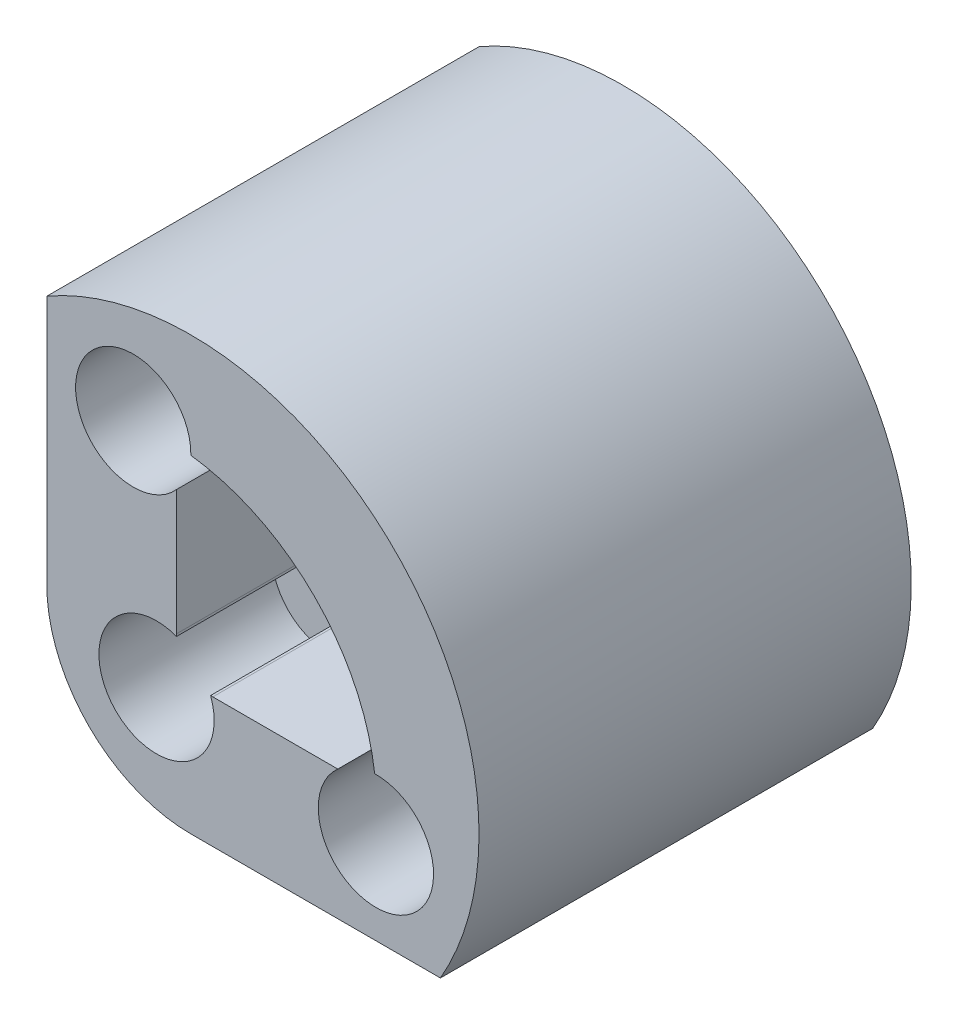
ISO-10303-21;
HEADER;
FILE_DESCRIPTION(('STEP AP214'),'2;1');
FILE_NAME('part.step','',(''),(''),'','','');
FILE_SCHEMA(('AUTOMOTIVE_DESIGN { 1 0 10303 214 1 1 1 1 }'));
ENDSEC;
DATA;
#1=APPLICATION_CONTEXT('core data for automotive mechanical design processes');
#2=APPLICATION_PROTOCOL_DEFINITION('international standard','automotive_design',2000,#1);
#3=PRODUCT_CONTEXT('',#1,'mechanical');
#4=PRODUCT('Part','Part','',(#3));
#5=PRODUCT_RELATED_PRODUCT_CATEGORY('part','',(#4));
#6=PRODUCT_DEFINITION_FORMATION('','',#4);
#7=PRODUCT_DEFINITION_CONTEXT('part definition',#1,'design');
#8=PRODUCT_DEFINITION('design','',#6,#7);
#9=PRODUCT_DEFINITION_SHAPE('','',#8);
#10=(LENGTH_UNIT() NAMED_UNIT(*) SI_UNIT(.MILLI.,.METRE.));
#11=(NAMED_UNIT(*) PLANE_ANGLE_UNIT() SI_UNIT($,.RADIAN.));
#12=(NAMED_UNIT(*) SI_UNIT($,.STERADIAN.) SOLID_ANGLE_UNIT());
#13=UNCERTAINTY_MEASURE_WITH_UNIT(LENGTH_MEASURE(1.E-05),#10,'distance_accuracy_value','');
#14=(GEOMETRIC_REPRESENTATION_CONTEXT(3) GLOBAL_UNCERTAINTY_ASSIGNED_CONTEXT((#13)) GLOBAL_UNIT_ASSIGNED_CONTEXT((#10,
#11,#12)) REPRESENTATION_CONTEXT('',''));
#15=CARTESIAN_POINT('',(0.,0.,0.));
#16=DIRECTION('',(0.,0.,1.));
#17=DIRECTION('',(1.,0.,0.));
#18=AXIS2_PLACEMENT_3D('',#15,#16,#17);
#19=CARTESIAN_POINT('',(-2.49999999999997,-2.5,15.));
#20=DIRECTION('',(0.,0.,-1.));
#21=DIRECTION('',(-1.,0.,0.));
#22=AXIS2_PLACEMENT_3D('',#19,#20,#21);
#23=CYLINDRICAL_SURFACE('',#22,9.99999999999999);
#24=CARTESIAN_POINT('',(-2.49999999999997,-2.5,0.));
#25=DIRECTION('',(0.,0.,1.));
#26=DIRECTION('',(-1.,0.,0.));
#27=AXIS2_PLACEMENT_3D('',#24,#25,#26);
#28=CIRCLE('',#27,9.99999999999999);
#29=CARTESIAN_POINT('',(6.16025403784441,-7.49999999999999,0.));
#30=VERTEX_POINT('',#29);
#31=CARTESIAN_POINT('',(-7.50000000000002,6.16025403784435,0.));
#32=VERTEX_POINT('',#31);
#33=EDGE_CURVE('E251',#30,#32,#28,.T.);
#34=ORIENTED_EDGE('',*,*,#33,.T.);
#35=DIRECTION('',(0.,0.,-1.));
#36=VECTOR('',#35,1.);
#37=CARTESIAN_POINT('',(-7.50000000000002,6.16025403784435,15.));
#38=LINE('',#37,#36);
#39=CARTESIAN_POINT('',(-7.50000000000002,6.16025403784435,15.));
#40=VERTEX_POINT('',#39);
#41=EDGE_CURVE('E291',#40,#32,#38,.T.);
#42=ORIENTED_EDGE('',*,*,#41,.F.);
#43=CARTESIAN_POINT('',(-2.49999999999997,-2.5,15.));
#44=DIRECTION('',(0.,0.,1.));
#45=DIRECTION('',(-1.,0.,0.));
#46=AXIS2_PLACEMENT_3D('',#43,#44,#45);
#47=CIRCLE('',#46,9.99999999999999);
#48=CARTESIAN_POINT('',(6.16025403784441,-7.49999999999999,15.));
#49=VERTEX_POINT('',#48);
#50=EDGE_CURVE('E268',#49,#40,#47,.T.);
#51=ORIENTED_EDGE('',*,*,#50,.F.);
#52=DIRECTION('',(0.,0.,-1.));
#53=VECTOR('',#52,1.);
#54=CARTESIAN_POINT('',(6.16025403784441,-7.49999999999999,15.));
#55=LINE('',#54,#53);
#56=EDGE_CURVE('E277',#49,#30,#55,.T.);
#57=ORIENTED_EDGE('',*,*,#56,.T.);
#58=EDGE_LOOP('',(#34,#42,#51,#57));
#59=FACE_BOUND('',#58,.T.);
#60=ADVANCED_FACE('F39',(#59),#23,.T.);
#61=CARTESIAN_POINT('',(-7.50000000000002,6.16025403784435,15.));
#62=DIRECTION('',(1.,0.,0.));
#63=DIRECTION('',(0.,0.,-1.));
#64=AXIS2_PLACEMENT_3D('',#61,#62,#63);
#65=PLANE('',#64);
#66=DIRECTION('',(0.,-1.,0.));
#67=VECTOR('',#66,1.);
#68=CARTESIAN_POINT('',(-7.50000000000002,6.16025403784435,0.));
#69=LINE('',#68,#67);
#70=CARTESIAN_POINT('',(-7.50000000000002,-2.50000000000003,0.));
#71=VERTEX_POINT('',#70);
#72=EDGE_CURVE('E255',#32,#71,#69,.T.);
#73=ORIENTED_EDGE('',*,*,#72,.T.);
#74=DIRECTION('',(0.,0.,-1.));
#75=VECTOR('',#74,1.);
#76=CARTESIAN_POINT('',(-7.50000000000002,-2.50000000000003,15.));
#77=LINE('',#76,#75);
#78=CARTESIAN_POINT('',(-7.50000000000002,-2.50000000000003,15.));
#79=VERTEX_POINT('',#78);
#80=EDGE_CURVE('E288',#79,#71,#77,.T.);
#81=ORIENTED_EDGE('',*,*,#80,.F.);
#82=DIRECTION('',(0.,-1.,0.));
#83=VECTOR('',#82,1.);
#84=CARTESIAN_POINT('',(-7.50000000000002,6.16025403784435,15.));
#85=LINE('',#84,#83);
#86=EDGE_CURVE('E271',#40,#79,#85,.T.);
#87=ORIENTED_EDGE('',*,*,#86,.F.);
#88=ORIENTED_EDGE('',*,*,#41,.T.);
#89=EDGE_LOOP('',(#73,#81,#87,#88));
#90=FACE_BOUND('',#89,.T.);
#91=ADVANCED_FACE('F370',(#90),#65,.F.);
#92=CARTESIAN_POINT('',(-2.50000000000003,-2.5,15.));
#93=DIRECTION('',(0.,0.,-1.));
#94=DIRECTION('',(-1.,0.,0.));
#95=AXIS2_PLACEMENT_3D('',#92,#93,#94);
#96=CYLINDRICAL_SURFACE('',#95,4.99999999999999);
#97=CARTESIAN_POINT('',(-2.50000000000003,-2.5,0.));
#98=DIRECTION('',(0.,0.,1.));
#99=DIRECTION('',(-1.,0.,0.));
#100=AXIS2_PLACEMENT_3D('',#97,#98,#99);
#101=CIRCLE('',#100,4.99999999999999);
#102=CARTESIAN_POINT('',(-2.50000000000003,-7.49999999999999,0.));
#103=VERTEX_POINT('',#102);
#104=EDGE_CURVE('E280',#71,#103,#101,.T.);
#105=ORIENTED_EDGE('',*,*,#104,.T.);
#106=DIRECTION('',(0.,0.,-1.));
#107=VECTOR('',#106,1.);
#108=CARTESIAN_POINT('',(-2.50000000000003,-7.49999999999999,15.));
#109=LINE('',#108,#107);
#110=CARTESIAN_POINT('',(-2.50000000000003,-7.49999999999999,15.));
#111=VERTEX_POINT('',#110);
#112=EDGE_CURVE('E285',#111,#103,#109,.T.);
#113=ORIENTED_EDGE('',*,*,#112,.F.);
#114=CARTESIAN_POINT('',(-2.50000000000003,-2.5,15.));
#115=DIRECTION('',(0.,0.,1.));
#116=DIRECTION('',(-1.,0.,0.));
#117=AXIS2_PLACEMENT_3D('',#114,#115,#116);
#118=CIRCLE('',#117,4.99999999999999);
#119=EDGE_CURVE('E274',#79,#111,#118,.T.);
#120=ORIENTED_EDGE('',*,*,#119,.F.);
#121=ORIENTED_EDGE('',*,*,#80,.T.);
#122=EDGE_LOOP('',(#105,#113,#120,#121));
#123=FACE_BOUND('',#122,.T.);
#124=ADVANCED_FACE('F375',(#123),#96,.T.);
#125=CARTESIAN_POINT('',(6.16025403784441,-7.49999999999999,15.));
#126=DIRECTION('',(0.,1.,0.));
#127=DIRECTION('',(0.,0.,1.));
#128=AXIS2_PLACEMENT_3D('',#125,#126,#127);
#129=PLANE('',#128);
#130=DIRECTION('',(1.,0.,0.));
#131=VECTOR('',#130,1.);
#132=CARTESIAN_POINT('',(6.16025403784441,-7.49999999999999,0.));
#133=LINE('',#132,#131);
#134=EDGE_CURVE('E272',#103,#30,#133,.T.);
#135=ORIENTED_EDGE('',*,*,#134,.T.);
#136=ORIENTED_EDGE('',*,*,#56,.F.);
#137=DIRECTION('',(1.,0.,0.));
#138=VECTOR('',#137,1.);
#139=CARTESIAN_POINT('',(6.16025403784441,-7.49999999999999,15.));
#140=LINE('',#139,#138);
#141=EDGE_CURVE('E276',#111,#49,#140,.T.);
#142=ORIENTED_EDGE('',*,*,#141,.F.);
#143=ORIENTED_EDGE('',*,*,#112,.T.);
#144=EDGE_LOOP('',(#135,#136,#142,#143));
#145=FACE_BOUND('',#144,.T.);
#146=ADVANCED_FACE('F388',(#145),#129,.F.);
#147=CARTESIAN_POINT('',(-2.49999999999997,-2.5,15.));
#148=DIRECTION('',(0.,0.,-1.));
#149=DIRECTION('',(-1.,0.,0.));
#150=AXIS2_PLACEMENT_3D('',#147,#148,#149);
#151=PLANE('',#150);
#152=CARTESIAN_POINT('',(-3.39843387687094,-3.39843387687098,15.));
#153=DIRECTION('',(0.,0.,1.));
#154=DIRECTION('',(-1.,0.,0.));
#155=AXIS2_PLACEMENT_3D('',#152,#153,#154);
#156=CIRCLE('',#155,7.33188414326815);
#157=CARTESIAN_POINT('',(3.8782566815932,-2.50049200421673,15.));
#158=VERTEX_POINT('',#157);
#159=CARTESIAN_POINT('',(-2.50049200421676,3.87825668159317,15.));
#160=VERTEX_POINT('',#159);
#161=EDGE_CURVE('E316',#158,#160,#156,.T.);
#162=ORIENTED_EDGE('',*,*,#161,.F.);
#163=CARTESIAN_POINT('',(3.92261628933258,-4.49999999999999,15.));
#164=DIRECTION('',(0.,0.,1.));
#165=DIRECTION('',(1.,0.,0.));
#166=AXIS2_PLACEMENT_3D('',#163,#164,#165);
#167=CIRCLE('',#166,2.);
#168=CARTESIAN_POINT('',(2.59974063380028,-2.99999999999999,15.));
#169=VERTEX_POINT('',#168);
#170=EDGE_CURVE('E331',#169,#158,#167,.T.);
#171=ORIENTED_EDGE('',*,*,#170,.F.);
#172=DIRECTION('',(1.,0.,0.));
#173=VECTOR('',#172,1.);
#174=CARTESIAN_POINT('',(-1.73738371066742,-2.99999999999999,15.));
#175=LINE('',#174,#173);
#176=CARTESIAN_POINT('',(-1.73738371066742,-2.99999999999999,15.));
#177=VERTEX_POINT('',#176);
#178=EDGE_CURVE('E261',#177,#169,#175,.T.);
#179=ORIENTED_EDGE('',*,*,#178,.F.);
#180=CARTESIAN_POINT('',(-1.73738371066745,-1.73738371066743,15.));
#181=DIRECTION('',(0.,0.,1.));
#182=DIRECTION('',(1.,0.,0.));
#183=AXIS2_PLACEMENT_3D('',#180,#181,#182);
#184=CIRCLE('',#183,1.26261628933257);
#185=CARTESIAN_POINT('',(-1.81483196734758,-2.99762244266432,15.));
#186=VERTEX_POINT('',#185);
#187=EDGE_CURVE('E315',#186,#177,#184,.T.);
#188=ORIENTED_EDGE('',*,*,#187,.F.);
#189=CARTESIAN_POINT('',(-3.69084842267091,-3.69084842267092,15.));
#190=DIRECTION('',(0.,0.,1.));
#191=DIRECTION('',(1.,0.,0.));
#192=AXIS2_PLACEMENT_3D('',#189,#190,#191);
#193=CIRCLE('',#192,2.);
#194=CARTESIAN_POINT('',(-2.99762244266435,-1.81483196734758,15.));
#195=VERTEX_POINT('',#194);
#196=EDGE_CURVE('E346',#195,#186,#193,.T.);
#197=ORIENTED_EDGE('',*,*,#196,.F.);
#198=CARTESIAN_POINT('',(-3.00000000000002,-1.73738371066746,15.));
#199=VERTEX_POINT('',#198);
#200=EDGE_CURVE('E318',#199,#195,#184,.T.);
#201=ORIENTED_EDGE('',*,*,#200,.F.);
#202=DIRECTION('',(0.,-1.,0.));
#203=VECTOR('',#202,1.);
#204=CARTESIAN_POINT('',(-3.00000000000002,3.92261628933255,15.));
#205=LINE('',#204,#203);
#206=CARTESIAN_POINT('',(-3.00000000000002,2.59974063380025,15.));
#207=VERTEX_POINT('',#206);
#208=EDGE_CURVE('E310',#207,#199,#205,.T.);
#209=ORIENTED_EDGE('',*,*,#208,.F.);
#210=CARTESIAN_POINT('',(-4.50000000000002,3.92261628933255,15.));
#211=DIRECTION('',(0.,0.,1.));
#212=DIRECTION('',(1.,0.,0.));
#213=AXIS2_PLACEMENT_3D('',#210,#211,#212);
#214=CIRCLE('',#213,2.);
#215=EDGE_CURVE('E337',#160,#207,#214,.T.);
#216=ORIENTED_EDGE('',*,*,#215,.F.);
#217=EDGE_LOOP('',(#162,#171,#179,#188,#197,#201,#209,#216));
#218=FACE_BOUND('',#217,.T.);
#219=ORIENTED_EDGE('',*,*,#50,.T.);
#220=ORIENTED_EDGE('',*,*,#86,.T.);
#221=ORIENTED_EDGE('',*,*,#119,.T.);
#222=ORIENTED_EDGE('',*,*,#141,.T.);
#223=EDGE_LOOP('',(#219,#220,#221,#222));
#224=FACE_BOUND('',#223,.T.);
#225=ADVANCED_FACE('F328',(#218,#224),#151,.F.);
#226=CARTESIAN_POINT('',(-2.49999999999997,-2.5,0.));
#227=DIRECTION('',(0.,0.,-1.));
#228=DIRECTION('',(-1.,0.,0.));
#229=AXIS2_PLACEMENT_3D('',#226,#227,#228);
#230=PLANE('',#229);
#231=CARTESIAN_POINT('',(-4.50000000000002,3.92261628933255,0.));
#232=DIRECTION('',(0.,0.,-1.));
#233=DIRECTION('',(-1.,0.,0.));
#234=AXIS2_PLACEMENT_3D('',#231,#232,#233);
#235=CIRCLE('',#234,2.);
#236=CARTESIAN_POINT('',(-3.00000000000002,2.59974063380025,0.));
#237=VERTEX_POINT('',#236);
#238=CARTESIAN_POINT('',(-2.50049200421676,3.87825668159317,0.));
#239=VERTEX_POINT('',#238);
#240=EDGE_CURVE('E174',#237,#239,#235,.T.);
#241=ORIENTED_EDGE('',*,*,#240,.F.);
#242=DIRECTION('',(0.,1.,0.));
#243=VECTOR('',#242,1.);
#244=CARTESIAN_POINT('',(-3.00000000000002,-2.5,0.));
#245=LINE('',#244,#243);
#246=CARTESIAN_POINT('',(-3.00000000000002,-1.73738371066746,0.));
#247=VERTEX_POINT('',#246);
#248=EDGE_CURVE('E294',#247,#237,#245,.T.);
#249=ORIENTED_EDGE('',*,*,#248,.F.);
#250=CARTESIAN_POINT('',(-1.73738371066745,-1.73738371066743,0.));
#251=DIRECTION('',(0.,0.,-1.));
#252=DIRECTION('',(-1.,0.,0.));
#253=AXIS2_PLACEMENT_3D('',#250,#251,#252);
#254=CIRCLE('',#253,1.26261628933257);
#255=CARTESIAN_POINT('',(-2.99762244266435,-1.81483196734758,0.));
#256=VERTEX_POINT('',#255);
#257=EDGE_CURVE('E295',#256,#247,#254,.T.);
#258=ORIENTED_EDGE('',*,*,#257,.F.);
#259=CARTESIAN_POINT('',(-3.69084842267091,-3.69084842267092,0.));
#260=DIRECTION('',(0.,0.,-1.));
#261=DIRECTION('',(-1.,0.,0.));
#262=AXIS2_PLACEMENT_3D('',#259,#260,#261);
#263=CIRCLE('',#262,2.);
#264=CARTESIAN_POINT('',(-1.81483196734758,-2.99762244266432,0.));
#265=VERTEX_POINT('',#264);
#266=EDGE_CURVE('E187',#265,#256,#263,.T.);
#267=ORIENTED_EDGE('',*,*,#266,.F.);
#268=CARTESIAN_POINT('',(-1.73738371066742,-2.99999999999999,0.));
#269=VERTEX_POINT('',#268);
#270=EDGE_CURVE('E210',#269,#265,#254,.T.);
#271=ORIENTED_EDGE('',*,*,#270,.F.);
#272=DIRECTION('',(-1.,0.,0.));
#273=VECTOR('',#272,1.);
#274=CARTESIAN_POINT('',(-2.49999999999997,-2.99999999999999,0.));
#275=LINE('',#274,#273);
#276=CARTESIAN_POINT('',(2.59974063380028,-2.99999999999999,0.));
#277=VERTEX_POINT('',#276);
#278=EDGE_CURVE('E205',#277,#269,#275,.T.);
#279=ORIENTED_EDGE('',*,*,#278,.F.);
#280=CARTESIAN_POINT('',(3.92261628933258,-4.49999999999999,0.));
#281=DIRECTION('',(0.,0.,-1.));
#282=DIRECTION('',(-1.,0.,0.));
#283=AXIS2_PLACEMENT_3D('',#280,#281,#282);
#284=CIRCLE('',#283,2.);
#285=CARTESIAN_POINT('',(3.8782566815932,-2.50049200421673,0.));
#286=VERTEX_POINT('',#285);
#287=EDGE_CURVE('E203',#286,#277,#284,.T.);
#288=ORIENTED_EDGE('',*,*,#287,.F.);
#289=CARTESIAN_POINT('',(-3.39843387687094,-3.39843387687098,0.));
#290=DIRECTION('',(0.,0.,-1.));
#291=DIRECTION('',(-1.,0.,0.));
#292=AXIS2_PLACEMENT_3D('',#289,#290,#291);
#293=CIRCLE('',#292,7.33188414326815);
#294=EDGE_CURVE('E194',#239,#286,#293,.T.);
#295=ORIENTED_EDGE('',*,*,#294,.F.);
#296=EDGE_LOOP('',(#241,#249,#258,#267,#271,#279,#288,#295));
#297=FACE_BOUND('',#296,.T.);
#298=ORIENTED_EDGE('',*,*,#33,.F.);
#299=ORIENTED_EDGE('',*,*,#134,.F.);
#300=ORIENTED_EDGE('',*,*,#104,.F.);
#301=ORIENTED_EDGE('',*,*,#72,.F.);
#302=EDGE_LOOP('',(#298,#299,#300,#301));
#303=FACE_BOUND('',#302,.T.);
#304=ADVANCED_FACE('F200',(#297,#303),#230,.T.);
#305=CARTESIAN_POINT('',(-3.39843387687094,-3.39843387687098,-225.));
#306=DIRECTION('',(0.,0.,1.));
#307=DIRECTION('',(1.,0.,0.));
#308=AXIS2_PLACEMENT_3D('',#305,#306,#307);
#309=CYLINDRICAL_SURFACE('',#308,7.33188414326815);
#310=CARTESIAN_POINT('',(-3.39843387687094,-3.39843387687098,6.00000000000001));
#311=DIRECTION('',(0.,0.,-1.));
#312=DIRECTION('',(-1.,0.,0.));
#313=AXIS2_PLACEMENT_3D('',#310,#311,#312);
#314=CIRCLE('',#313,7.33188414326815);
#315=CARTESIAN_POINT('',(-2.50049200421676,3.87825668159317,6.));
#316=VERTEX_POINT('',#315);
#317=CARTESIAN_POINT('',(-3.00000000000002,3.92261628933255,6.00000000000001));
#318=VERTEX_POINT('',#317);
#319=EDGE_CURVE('E196',#316,#318,#314,.F.);
#320=ORIENTED_EDGE('',*,*,#319,.F.);
#321=DIRECTION('',(0.,0.,-1.));
#322=VECTOR('',#321,1.);
#323=CARTESIAN_POINT('',(-2.50049200421676,3.87825668159317,3.));
#324=LINE('',#323,#322);
#325=EDGE_CURVE('E178',#316,#239,#324,.T.);
#326=ORIENTED_EDGE('',*,*,#325,.T.);
#327=ORIENTED_EDGE('',*,*,#294,.T.);
#328=DIRECTION('',(0.,0.,-1.));
#329=VECTOR('',#328,1.);
#330=CARTESIAN_POINT('',(3.8782566815932,-2.50049200421673,3.));
#331=LINE('',#330,#329);
#332=CARTESIAN_POINT('',(3.8782566815932,-2.50049200421673,6.));
#333=VERTEX_POINT('',#332);
#334=EDGE_CURVE('E247',#286,#333,#331,.F.);
#335=ORIENTED_EDGE('',*,*,#334,.T.);
#336=CARTESIAN_POINT('',(-3.39843387687094,-3.39843387687098,6.00000000000001));
#337=DIRECTION('',(0.,0.,-1.));
#338=DIRECTION('',(-1.,0.,0.));
#339=AXIS2_PLACEMENT_3D('',#336,#337,#338);
#340=CIRCLE('',#339,7.33188414326815);
#341=CARTESIAN_POINT('',(3.92261628933258,-2.99999999999999,6.00000000000001));
#342=VERTEX_POINT('',#341);
#343=EDGE_CURVE('E197',#342,#333,#340,.F.);
#344=ORIENTED_EDGE('',*,*,#343,.F.);
#345=DIRECTION('',(0.,0.,1.));
#346=VECTOR('',#345,1.);
#347=CARTESIAN_POINT('',(3.92261628933258,-2.99999999999999,-225.));
#348=LINE('',#347,#346);
#349=CARTESIAN_POINT('',(3.92261628933258,-2.99999999999999,9.00000000000001));
#350=VERTEX_POINT('',#349);
#351=EDGE_CURVE('E245',#342,#350,#348,.T.);
#352=ORIENTED_EDGE('',*,*,#351,.T.);
#353=CARTESIAN_POINT('',(-3.39843387687094,-3.39843387687098,9.00000000000001));
#354=DIRECTION('',(0.,0.,1.));
#355=DIRECTION('',(1.,0.,0.));
#356=AXIS2_PLACEMENT_3D('',#353,#354,#355);
#357=CIRCLE('',#356,7.33188414326815);
#358=CARTESIAN_POINT('',(3.8782566815932,-2.50049200421673,9.));
#359=VERTEX_POINT('',#358);
#360=EDGE_CURVE('E352',#359,#350,#357,.F.);
#361=ORIENTED_EDGE('',*,*,#360,.F.);
#362=DIRECTION('',(0.,0.,1.));
#363=VECTOR('',#362,1.);
#364=CARTESIAN_POINT('',(3.8782566815932,-2.50049200421673,12.));
#365=LINE('',#364,#363);
#366=EDGE_CURVE('E320',#359,#158,#365,.T.);
#367=ORIENTED_EDGE('',*,*,#366,.T.);
#368=ORIENTED_EDGE('',*,*,#161,.T.);
#369=DIRECTION('',(0.,0.,1.));
#370=VECTOR('',#369,1.);
#371=CARTESIAN_POINT('',(-2.50049200421676,3.87825668159317,12.));
#372=LINE('',#371,#370);
#373=CARTESIAN_POINT('',(-2.50049200421676,3.87825668159317,9.));
#374=VERTEX_POINT('',#373);
#375=EDGE_CURVE('E349',#160,#374,#372,.F.);
#376=ORIENTED_EDGE('',*,*,#375,.T.);
#377=CARTESIAN_POINT('',(-3.39843387687094,-3.39843387687098,9.00000000000001));
#378=DIRECTION('',(0.,0.,1.));
#379=DIRECTION('',(1.,0.,0.));
#380=AXIS2_PLACEMENT_3D('',#377,#378,#379);
#381=CIRCLE('',#380,7.33188414326815);
#382=CARTESIAN_POINT('',(-3.00000000000002,3.92261628933255,9.00000000000001));
#383=VERTEX_POINT('',#382);
#384=EDGE_CURVE('E345',#383,#374,#381,.F.);
#385=ORIENTED_EDGE('',*,*,#384,.F.);
#386=DIRECTION('',(0.,0.,1.));
#387=VECTOR('',#386,1.);
#388=CARTESIAN_POINT('',(-3.00000000000002,3.92261628933255,-225.));
#389=LINE('',#388,#387);
#390=EDGE_CURVE('E266',#318,#383,#389,.T.);
#391=ORIENTED_EDGE('',*,*,#390,.F.);
#392=EDGE_LOOP('',(#320,#326,#327,#335,#344,#352,#361,#367,#368,#376,#385,#391));
#393=FACE_BOUND('',#392,.T.);
#394=ADVANCED_FACE('F192',(#393),#309,.F.);
#395=CARTESIAN_POINT('',(-1.73738371066742,-2.99999999999999,-225.));
#396=DIRECTION('',(0.,-1.,0.));
#397=DIRECTION('',(0.,0.,-1.));
#398=AXIS2_PLACEMENT_3D('',#395,#396,#397);
#399=PLANE('',#398);
#400=DIRECTION('',(1.,0.,0.));
#401=VECTOR('',#400,1.);
#402=CARTESIAN_POINT('',(-1.73738371066742,-2.99999999999999,6.00000000000001));
#403=LINE('',#402,#401);
#404=CARTESIAN_POINT('',(2.59974063380028,-2.99999999999999,6.));
#405=VERTEX_POINT('',#404);
#406=EDGE_CURVE('E46',#405,#342,#403,.T.);
#407=ORIENTED_EDGE('',*,*,#406,.F.);
#408=DIRECTION('',(0.,0.,-1.));
#409=VECTOR('',#408,1.);
#410=CARTESIAN_POINT('',(2.59974063380028,-2.99999999999999,6.));
#411=LINE('',#410,#409);
#412=EDGE_CURVE('E11',#405,#277,#411,.T.);
#413=ORIENTED_EDGE('',*,*,#412,.T.);
#414=ORIENTED_EDGE('',*,*,#278,.T.);
#415=DIRECTION('',(0.,0.,1.));
#416=VECTOR('',#415,1.);
#417=CARTESIAN_POINT('',(-1.73738371066742,-2.99999999999999,-225.));
#418=LINE('',#417,#416);
#419=EDGE_CURVE('E252',#269,#177,#418,.T.);
#420=ORIENTED_EDGE('',*,*,#419,.T.);
#421=ORIENTED_EDGE('',*,*,#178,.T.);
#422=DIRECTION('',(0.,0.,1.));
#423=VECTOR('',#422,1.);
#424=CARTESIAN_POINT('',(2.59974063380028,-2.99999999999999,9.));
#425=LINE('',#424,#423);
#426=CARTESIAN_POINT('',(2.59974063380028,-2.99999999999999,9.));
#427=VERTEX_POINT('',#426);
#428=EDGE_CURVE('E226',#169,#427,#425,.F.);
#429=ORIENTED_EDGE('',*,*,#428,.T.);
#430=DIRECTION('',(-1.,0.,0.));
#431=VECTOR('',#430,1.);
#432=CARTESIAN_POINT('',(-1.73738371066742,-2.99999999999999,9.00000000000001));
#433=LINE('',#432,#431);
#434=EDGE_CURVE('E224',#350,#427,#433,.T.);
#435=ORIENTED_EDGE('',*,*,#434,.F.);
#436=ORIENTED_EDGE('',*,*,#351,.F.);
#437=EDGE_LOOP('',(#407,#413,#414,#420,#421,#429,#435,#436));
#438=FACE_BOUND('',#437,.T.);
#439=ADVANCED_FACE('F250',(#438),#399,.F.);
#440=CARTESIAN_POINT('',(-1.73738371066745,-1.73738371066743,-225.));
#441=DIRECTION('',(0.,0.,1.));
#442=DIRECTION('',(1.,0.,0.));
#443=AXIS2_PLACEMENT_3D('',#440,#441,#442);
#444=CYLINDRICAL_SURFACE('',#443,1.26261628933257);
#445=ORIENTED_EDGE('',*,*,#270,.T.);
#446=DIRECTION('',(0.,0.,-1.));
#447=VECTOR('',#446,1.);
#448=CARTESIAN_POINT('',(-1.81483196734758,-2.99762244266432,3.));
#449=LINE('',#448,#447);
#450=CARTESIAN_POINT('',(-1.81483196734758,-2.99762244266432,6.));
#451=VERTEX_POINT('',#450);
#452=EDGE_CURVE('E237',#265,#451,#449,.F.);
#453=ORIENTED_EDGE('',*,*,#452,.T.);
#454=CARTESIAN_POINT('',(-1.73738371066745,-1.73738371066743,6.00000000000001));
#455=DIRECTION('',(0.,0.,-1.));
#456=DIRECTION('',(-1.,0.,0.));
#457=AXIS2_PLACEMENT_3D('',#454,#455,#456);
#458=CIRCLE('',#457,1.26261628933257);
#459=CARTESIAN_POINT('',(-2.99762244266435,-1.81483196734758,6.));
#460=VERTEX_POINT('',#459);
#461=EDGE_CURVE('E232',#460,#451,#458,.F.);
#462=ORIENTED_EDGE('',*,*,#461,.F.);
#463=DIRECTION('',(0.,0.,-1.));
#464=VECTOR('',#463,1.);
#465=CARTESIAN_POINT('',(-2.99762244266435,-1.81483196734758,3.));
#466=LINE('',#465,#464);
#467=EDGE_CURVE('E234',#460,#256,#466,.T.);
#468=ORIENTED_EDGE('',*,*,#467,.T.);
#469=ORIENTED_EDGE('',*,*,#257,.T.);
#470=DIRECTION('',(0.,0.,1.));
#471=VECTOR('',#470,1.);
#472=CARTESIAN_POINT('',(-3.00000000000002,-1.73738371066746,-225.));
#473=LINE('',#472,#471);
#474=EDGE_CURVE('E258',#247,#199,#473,.T.);
#475=ORIENTED_EDGE('',*,*,#474,.T.);
#476=ORIENTED_EDGE('',*,*,#200,.T.);
#477=DIRECTION('',(0.,0.,1.));
#478=VECTOR('',#477,1.);
#479=CARTESIAN_POINT('',(-2.99762244266435,-1.81483196734758,12.));
#480=LINE('',#479,#478);
#481=CARTESIAN_POINT('',(-2.99762244266435,-1.81483196734758,9.00000000000001));
#482=VERTEX_POINT('',#481);
#483=EDGE_CURVE('E218',#195,#482,#480,.F.);
#484=ORIENTED_EDGE('',*,*,#483,.T.);
#485=CARTESIAN_POINT('',(-1.73738371066745,-1.73738371066743,9.00000000000001));
#486=DIRECTION('',(0.,0.,1.));
#487=DIRECTION('',(1.,0.,0.));
#488=AXIS2_PLACEMENT_3D('',#485,#486,#487);
#489=CIRCLE('',#488,1.26261628933257);
#490=CARTESIAN_POINT('',(-1.81483196734758,-2.99762244266432,9.00000000000001));
#491=VERTEX_POINT('',#490);
#492=EDGE_CURVE('E216',#491,#482,#489,.F.);
#493=ORIENTED_EDGE('',*,*,#492,.F.);
#494=DIRECTION('',(0.,0.,1.));
#495=VECTOR('',#494,1.);
#496=CARTESIAN_POINT('',(-1.81483196734758,-2.99762244266432,12.));
#497=LINE('',#496,#495);
#498=EDGE_CURVE('E221',#491,#186,#497,.T.);
#499=ORIENTED_EDGE('',*,*,#498,.T.);
#500=ORIENTED_EDGE('',*,*,#187,.T.);
#501=ORIENTED_EDGE('',*,*,#419,.F.);
#502=EDGE_LOOP('',(#445,#453,#462,#468,#469,#475,#476,#484,#493,#499,#500,#501));
#503=FACE_BOUND('',#502,.T.);
#504=ADVANCED_FACE('F302',(#503),#444,.F.);
#505=CARTESIAN_POINT('',(-3.00000000000002,3.92261628933255,-225.));
#506=DIRECTION('',(-1.,0.,0.));
#507=DIRECTION('',(0.,-1.,0.));
#508=AXIS2_PLACEMENT_3D('',#505,#506,#507);
#509=PLANE('',#508);
#510=ORIENTED_EDGE('',*,*,#248,.T.);
#511=DIRECTION('',(0.,0.,-1.));
#512=VECTOR('',#511,1.);
#513=CARTESIAN_POINT('',(-3.00000000000002,2.59974063380025,6.));
#514=LINE('',#513,#512);
#515=CARTESIAN_POINT('',(-3.00000000000002,2.59974063380025,6.));
#516=VERTEX_POINT('',#515);
#517=EDGE_CURVE('E181',#237,#516,#514,.F.);
#518=ORIENTED_EDGE('',*,*,#517,.T.);
#519=DIRECTION('',(0.,-1.,0.));
#520=VECTOR('',#519,1.);
#521=CARTESIAN_POINT('',(-3.00000000000002,3.92261628933255,6.00000000000001));
#522=LINE('',#521,#520);
#523=EDGE_CURVE('E229',#318,#516,#522,.T.);
#524=ORIENTED_EDGE('',*,*,#523,.F.);
#525=ORIENTED_EDGE('',*,*,#390,.T.);
#526=DIRECTION('',(0.,1.,0.));
#527=VECTOR('',#526,1.);
#528=CARTESIAN_POINT('',(-3.00000000000002,3.92261628933255,9.00000000000001));
#529=LINE('',#528,#527);
#530=CARTESIAN_POINT('',(-3.00000000000002,2.59974063380025,9.));
#531=VERTEX_POINT('',#530);
#532=EDGE_CURVE('E204',#531,#383,#529,.T.);
#533=ORIENTED_EDGE('',*,*,#532,.F.);
#534=DIRECTION('',(0.,0.,1.));
#535=VECTOR('',#534,1.);
#536=CARTESIAN_POINT('',(-3.00000000000002,2.59974063380025,9.));
#537=LINE('',#536,#535);
#538=EDGE_CURVE('E208',#531,#207,#537,.T.);
#539=ORIENTED_EDGE('',*,*,#538,.T.);
#540=ORIENTED_EDGE('',*,*,#208,.T.);
#541=ORIENTED_EDGE('',*,*,#474,.F.);
#542=EDGE_LOOP('',(#510,#518,#524,#525,#533,#539,#540,#541));
#543=FACE_BOUND('',#542,.T.);
#544=ADVANCED_FACE('F308',(#543),#509,.F.);
#545=CARTESIAN_POINT('',(-4.50000000000002,3.92261628933255,9.));
#546=DIRECTION('',(0.,0.,1.));
#547=DIRECTION('',(1.,0.,0.));
#548=AXIS2_PLACEMENT_3D('',#545,#546,#547);
#549=CYLINDRICAL_SURFACE('',#548,2.);
#550=ORIENTED_EDGE('',*,*,#215,.T.);
#551=ORIENTED_EDGE('',*,*,#538,.F.);
#552=CARTESIAN_POINT('',(-4.50000000000002,3.92261628933255,9.));
#553=DIRECTION('',(0.,0.,1.));
#554=DIRECTION('',(1.,0.,0.));
#555=AXIS2_PLACEMENT_3D('',#552,#553,#554);
#556=CIRCLE('',#555,2.);
#557=EDGE_CURVE('E334',#374,#531,#556,.T.);
#558=ORIENTED_EDGE('',*,*,#557,.F.);
#559=ORIENTED_EDGE('',*,*,#375,.F.);
#560=EDGE_LOOP('',(#550,#551,#558,#559));
#561=FACE_BOUND('',#560,.T.);
#562=ADVANCED_FACE('F404',(#561),#549,.F.);
#563=CARTESIAN_POINT('',(-4.50000000000002,3.92261628933255,9.));
#564=DIRECTION('',(0.,0.,1.));
#565=DIRECTION('',(1.,0.,0.));
#566=AXIS2_PLACEMENT_3D('',#563,#564,#565);
#567=PLANE('',#566);
#568=ORIENTED_EDGE('',*,*,#384,.T.);
#569=ORIENTED_EDGE('',*,*,#557,.T.);
#570=ORIENTED_EDGE('',*,*,#532,.T.);
#571=EDGE_LOOP('',(#568,#569,#570));
#572=FACE_BOUND('',#571,.T.);
#573=ADVANCED_FACE('F411',(#572),#567,.T.);
#574=CARTESIAN_POINT('',(-3.69084842267091,-3.69084842267092,9.));
#575=DIRECTION('',(0.,0.,1.));
#576=DIRECTION('',(1.,0.,0.));
#577=AXIS2_PLACEMENT_3D('',#574,#575,#576);
#578=CYLINDRICAL_SURFACE('',#577,2.);
#579=CARTESIAN_POINT('',(-3.69084842267091,-3.69084842267092,9.));
#580=DIRECTION('',(0.,0.,1.));
#581=DIRECTION('',(1.,0.,0.));
#582=AXIS2_PLACEMENT_3D('',#579,#580,#581);
#583=CIRCLE('',#582,2.);
#584=EDGE_CURVE('E343',#482,#491,#583,.T.);
#585=ORIENTED_EDGE('',*,*,#584,.F.);
#586=ORIENTED_EDGE('',*,*,#483,.F.);
#587=ORIENTED_EDGE('',*,*,#196,.T.);
#588=ORIENTED_EDGE('',*,*,#498,.F.);
#589=EDGE_LOOP('',(#585,#586,#587,#588));
#590=FACE_BOUND('',#589,.T.);
#591=ADVANCED_FACE('F409',(#590),#578,.F.);
#592=CARTESIAN_POINT('',(-3.69084842267091,-3.69084842267092,9.));
#593=DIRECTION('',(0.,0.,1.));
#594=DIRECTION('',(1.,0.,0.));
#595=AXIS2_PLACEMENT_3D('',#592,#593,#594);
#596=PLANE('',#595);
#597=ORIENTED_EDGE('',*,*,#492,.T.);
#598=ORIENTED_EDGE('',*,*,#584,.T.);
#599=EDGE_LOOP('',(#597,#598));
#600=FACE_BOUND('',#599,.T.);
#601=ADVANCED_FACE('F366',(#600),#596,.T.);
#602=CARTESIAN_POINT('',(3.92261628933258,-4.49999999999999,9.));
#603=DIRECTION('',(0.,0.,1.));
#604=DIRECTION('',(1.,0.,0.));
#605=AXIS2_PLACEMENT_3D('',#602,#603,#604);
#606=CYLINDRICAL_SURFACE('',#605,2.);
#607=CARTESIAN_POINT('',(3.92261628933258,-4.49999999999999,9.));
#608=DIRECTION('',(0.,0.,1.));
#609=DIRECTION('',(1.,0.,0.));
#610=AXIS2_PLACEMENT_3D('',#607,#608,#609);
#611=CIRCLE('',#610,2.);
#612=EDGE_CURVE('E335',#427,#359,#611,.T.);
#613=ORIENTED_EDGE('',*,*,#612,.F.);
#614=ORIENTED_EDGE('',*,*,#428,.F.);
#615=ORIENTED_EDGE('',*,*,#170,.T.);
#616=ORIENTED_EDGE('',*,*,#366,.F.);
#617=EDGE_LOOP('',(#613,#614,#615,#616));
#618=FACE_BOUND('',#617,.T.);
#619=ADVANCED_FACE('F354',(#618),#606,.F.);
#620=CARTESIAN_POINT('',(3.92261628933258,-4.49999999999999,9.));
#621=DIRECTION('',(0.,0.,1.));
#622=DIRECTION('',(1.,0.,0.));
#623=AXIS2_PLACEMENT_3D('',#620,#621,#622);
#624=PLANE('',#623);
#625=ORIENTED_EDGE('',*,*,#360,.T.);
#626=ORIENTED_EDGE('',*,*,#434,.T.);
#627=ORIENTED_EDGE('',*,*,#612,.T.);
#628=EDGE_LOOP('',(#625,#626,#627));
#629=FACE_BOUND('',#628,.T.);
#630=ADVANCED_FACE('F356',(#629),#624,.T.);
#631=CARTESIAN_POINT('',(-4.50000000000002,3.92261628933255,6.));
#632=DIRECTION('',(0.,0.,-1.));
#633=DIRECTION('',(-1.,0.,0.));
#634=AXIS2_PLACEMENT_3D('',#631,#632,#633);
#635=CYLINDRICAL_SURFACE('',#634,2.);
#636=CARTESIAN_POINT('',(-4.50000000000002,3.92261628933255,6.));
#637=DIRECTION('',(0.,0.,-1.));
#638=DIRECTION('',(-1.,0.,0.));
#639=AXIS2_PLACEMENT_3D('',#636,#637,#638);
#640=CIRCLE('',#639,2.);
#641=EDGE_CURVE('E186',#516,#316,#640,.T.);
#642=ORIENTED_EDGE('',*,*,#641,.F.);
#643=ORIENTED_EDGE('',*,*,#517,.F.);
#644=ORIENTED_EDGE('',*,*,#240,.T.);
#645=ORIENTED_EDGE('',*,*,#325,.F.);
#646=EDGE_LOOP('',(#642,#643,#644,#645));
#647=FACE_BOUND('',#646,.T.);
#648=ADVANCED_FACE('F177',(#647),#635,.F.);
#649=CARTESIAN_POINT('',(-4.50000000000002,3.92261628933255,6.));
#650=DIRECTION('',(0.,0.,-1.));
#651=DIRECTION('',(-1.,0.,0.));
#652=AXIS2_PLACEMENT_3D('',#649,#650,#651);
#653=PLANE('',#652);
#654=ORIENTED_EDGE('',*,*,#319,.T.);
#655=ORIENTED_EDGE('',*,*,#523,.T.);
#656=ORIENTED_EDGE('',*,*,#641,.T.);
#657=EDGE_LOOP('',(#654,#655,#656));
#658=FACE_BOUND('',#657,.T.);
#659=ADVANCED_FACE('F364',(#658),#653,.T.);
#660=CARTESIAN_POINT('',(-3.69084842267091,-3.69084842267092,6.));
#661=DIRECTION('',(0.,0.,-1.));
#662=DIRECTION('',(-1.,0.,0.));
#663=AXIS2_PLACEMENT_3D('',#660,#661,#662);
#664=CYLINDRICAL_SURFACE('',#663,2.);
#665=ORIENTED_EDGE('',*,*,#266,.T.);
#666=ORIENTED_EDGE('',*,*,#467,.F.);
#667=CARTESIAN_POINT('',(-3.69084842267091,-3.69084842267092,6.));
#668=DIRECTION('',(0.,0.,-1.));
#669=DIRECTION('',(-1.,0.,0.));
#670=AXIS2_PLACEMENT_3D('',#667,#668,#669);
#671=CIRCLE('',#670,2.);
#672=EDGE_CURVE('E60',#451,#460,#671,.T.);
#673=ORIENTED_EDGE('',*,*,#672,.F.);
#674=ORIENTED_EDGE('',*,*,#452,.F.);
#675=EDGE_LOOP('',(#665,#666,#673,#674));
#676=FACE_BOUND('',#675,.T.);
#677=ADVANCED_FACE('F435',(#676),#664,.F.);
#678=CARTESIAN_POINT('',(-3.69084842267091,-3.69084842267092,6.));
#679=DIRECTION('',(0.,0.,-1.));
#680=DIRECTION('',(-1.,0.,0.));
#681=AXIS2_PLACEMENT_3D('',#678,#679,#680);
#682=PLANE('',#681);
#683=ORIENTED_EDGE('',*,*,#461,.T.);
#684=ORIENTED_EDGE('',*,*,#672,.T.);
#685=EDGE_LOOP('',(#683,#684));
#686=FACE_BOUND('',#685,.T.);
#687=ADVANCED_FACE('F440',(#686),#682,.T.);
#688=CARTESIAN_POINT('',(3.92261628933258,-4.49999999999999,6.));
#689=DIRECTION('',(0.,0.,-1.));
#690=DIRECTION('',(-1.,0.,0.));
#691=AXIS2_PLACEMENT_3D('',#688,#689,#690);
#692=CYLINDRICAL_SURFACE('',#691,2.);
#693=ORIENTED_EDGE('',*,*,#287,.T.);
#694=ORIENTED_EDGE('',*,*,#412,.F.);
#695=CARTESIAN_POINT('',(3.92261628933258,-4.49999999999999,6.));
#696=DIRECTION('',(0.,0.,-1.));
#697=DIRECTION('',(-1.,0.,0.));
#698=AXIS2_PLACEMENT_3D('',#695,#696,#697);
#699=CIRCLE('',#698,2.);
#700=EDGE_CURVE('E53',#333,#405,#699,.T.);
#701=ORIENTED_EDGE('',*,*,#700,.F.);
#702=ORIENTED_EDGE('',*,*,#334,.F.);
#703=EDGE_LOOP('',(#693,#694,#701,#702));
#704=FACE_BOUND('',#703,.T.);
#705=ADVANCED_FACE('F445',(#704),#692,.F.);
#706=CARTESIAN_POINT('',(3.92261628933258,-4.49999999999999,6.));
#707=DIRECTION('',(0.,0.,-1.));
#708=DIRECTION('',(-1.,0.,0.));
#709=AXIS2_PLACEMENT_3D('',#706,#707,#708);
#710=PLANE('',#709);
#711=ORIENTED_EDGE('',*,*,#343,.T.);
#712=ORIENTED_EDGE('',*,*,#700,.T.);
#713=ORIENTED_EDGE('',*,*,#406,.T.);
#714=EDGE_LOOP('',(#711,#712,#713));
#715=FACE_BOUND('',#714,.T.);
#716=ADVANCED_FACE('F241',(#715),#710,.T.);
#717=CLOSED_SHELL('',(#60,#91,#124,#146,#225,#304,#394,#439,#504,#544,#562,#573,#591,#601,#619,
#630,#648,#659,#677,#687,#705,#716));
#718=MANIFOLD_SOLID_BREP('B2',#717);
#719=ADVANCED_BREP_SHAPE_REPRESENTATION('',(#18,#718),#14);
#720=SHAPE_DEFINITION_REPRESENTATION(#9,#719);
ENDSEC;
END-ISO-10303-21;
